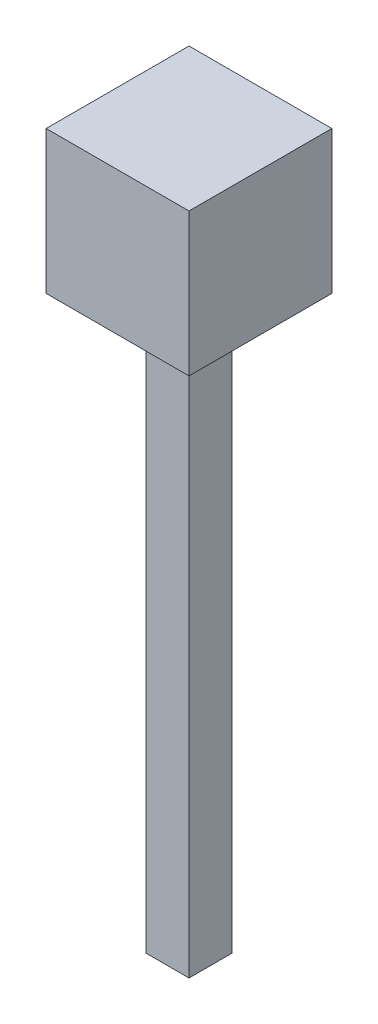
ISO-10303-21;
HEADER;
FILE_DESCRIPTION(('STEP AP214'),'2;1');
FILE_NAME('part.step','',(''),(''),'','','');
FILE_SCHEMA(('AUTOMOTIVE_DESIGN { 1 0 10303 214 1 1 1 1 }'));
ENDSEC;
DATA;
#1=APPLICATION_CONTEXT('core data for automotive mechanical design processes');
#2=APPLICATION_PROTOCOL_DEFINITION('international standard','automotive_design',2000,#1);
#3=PRODUCT_CONTEXT('',#1,'mechanical');
#4=PRODUCT('Part','Part','',(#3));
#5=PRODUCT_RELATED_PRODUCT_CATEGORY('part','',(#4));
#6=PRODUCT_DEFINITION_FORMATION('','',#4);
#7=PRODUCT_DEFINITION_CONTEXT('part definition',#1,'design');
#8=PRODUCT_DEFINITION('design','',#6,#7);
#9=PRODUCT_DEFINITION_SHAPE('','',#8);
#10=(LENGTH_UNIT() NAMED_UNIT(*) SI_UNIT(.MILLI.,.METRE.));
#11=(NAMED_UNIT(*) PLANE_ANGLE_UNIT() SI_UNIT($,.RADIAN.));
#12=(NAMED_UNIT(*) SI_UNIT($,.STERADIAN.) SOLID_ANGLE_UNIT());
#13=UNCERTAINTY_MEASURE_WITH_UNIT(LENGTH_MEASURE(1.E-05),#10,'distance_accuracy_value','');
#14=(GEOMETRIC_REPRESENTATION_CONTEXT(3) GLOBAL_UNCERTAINTY_ASSIGNED_CONTEXT((#13)) GLOBAL_UNIT_ASSIGNED_CONTEXT((#10,
#11,#12)) REPRESENTATION_CONTEXT('',''));
#15=CARTESIAN_POINT('',(0.,0.,0.));
#16=DIRECTION('',(0.,0.,1.));
#17=DIRECTION('',(1.,0.,0.));
#18=AXIS2_PLACEMENT_3D('',#15,#16,#17);
#19=CARTESIAN_POINT('',(3.,100.,0.));
#20=DIRECTION('',(1.,0.,0.));
#21=DIRECTION('',(0.,0.,-1.));
#22=AXIS2_PLACEMENT_3D('',#19,#20,#21);
#23=PLANE('',#22);
#24=DIRECTION('',(0.,-1.,0.));
#25=VECTOR('',#24,1.);
#26=CARTESIAN_POINT('',(3.,100.,-3.));
#27=LINE('',#26,#25);
#28=CARTESIAN_POINT('',(3.,80.,-3.));
#29=VERTEX_POINT('',#28);
#30=CARTESIAN_POINT('',(3.,0.,-3.));
#31=VERTEX_POINT('',#30);
#32=EDGE_CURVE('E55',#29,#31,#27,.T.);
#33=ORIENTED_EDGE('',*,*,#32,.F.);
#34=DIRECTION('',(0.,0.,1.));
#35=VECTOR('',#34,1.);
#36=CARTESIAN_POINT('',(3.,80.,0.));
#37=LINE('',#36,#35);
#38=CARTESIAN_POINT('',(3.,80.,3.));
#39=VERTEX_POINT('',#38);
#40=EDGE_CURVE('E171',#29,#39,#37,.T.);
#41=ORIENTED_EDGE('',*,*,#40,.T.);
#42=DIRECTION('',(0.,-1.,0.));
#43=VECTOR('',#42,1.);
#44=CARTESIAN_POINT('',(3.,100.,3.));
#45=LINE('',#44,#43);
#46=CARTESIAN_POINT('',(3.,0.,3.));
#47=VERTEX_POINT('',#46);
#48=EDGE_CURVE('E191',#39,#47,#45,.T.);
#49=ORIENTED_EDGE('',*,*,#48,.T.);
#50=DIRECTION('',(0.,0.,1.));
#51=VECTOR('',#50,1.);
#52=CARTESIAN_POINT('',(3.,0.,0.));
#53=LINE('',#52,#51);
#54=EDGE_CURVE('E175',#31,#47,#53,.T.);
#55=ORIENTED_EDGE('',*,*,#54,.F.);
#56=EDGE_LOOP('',(#33,#41,#49,#55));
#57=FACE_BOUND('',#56,.T.);
#58=ADVANCED_FACE('F47',(#57),#23,.T.);
#59=CARTESIAN_POINT('',(0.,100.,-3.));
#60=DIRECTION('',(0.,0.,-1.));
#61=DIRECTION('',(-1.,0.,0.));
#62=AXIS2_PLACEMENT_3D('',#59,#60,#61);
#63=PLANE('',#62);
#64=DIRECTION('',(0.,-1.,0.));
#65=VECTOR('',#64,1.);
#66=CARTESIAN_POINT('',(-3.,100.,-3.));
#67=LINE('',#66,#65);
#68=CARTESIAN_POINT('',(-3.,80.,-3.));
#69=VERTEX_POINT('',#68);
#70=CARTESIAN_POINT('',(-3.,0.,-3.));
#71=VERTEX_POINT('',#70);
#72=EDGE_CURVE('E197',#69,#71,#67,.T.);
#73=ORIENTED_EDGE('',*,*,#72,.F.);
#74=DIRECTION('',(1.,0.,0.));
#75=VECTOR('',#74,1.);
#76=CARTESIAN_POINT('',(0.,80.,-3.));
#77=LINE('',#76,#75);
#78=EDGE_CURVE('E62',#69,#29,#77,.T.);
#79=ORIENTED_EDGE('',*,*,#78,.T.);
#80=ORIENTED_EDGE('',*,*,#32,.T.);
#81=DIRECTION('',(1.,0.,0.));
#82=VECTOR('',#81,1.);
#83=CARTESIAN_POINT('',(0.,0.,-3.));
#84=LINE('',#83,#82);
#85=EDGE_CURVE('E179',#71,#31,#84,.T.);
#86=ORIENTED_EDGE('',*,*,#85,.F.);
#87=EDGE_LOOP('',(#73,#79,#80,#86));
#88=FACE_BOUND('',#87,.T.);
#89=ADVANCED_FACE('F202',(#88),#63,.T.);
#90=CARTESIAN_POINT('',(-3.,100.,0.));
#91=DIRECTION('',(1.,0.,0.));
#92=DIRECTION('',(0.,0.,-1.));
#93=AXIS2_PLACEMENT_3D('',#90,#91,#92);
#94=PLANE('',#93);
#95=DIRECTION('',(0.,0.,1.));
#96=VECTOR('',#95,1.);
#97=CARTESIAN_POINT('',(-3.,80.,0.));
#98=LINE('',#97,#96);
#99=CARTESIAN_POINT('',(-3.,80.,3.));
#100=VERTEX_POINT('',#99);
#101=EDGE_CURVE('E70',#69,#100,#98,.T.);
#102=ORIENTED_EDGE('',*,*,#101,.F.);
#103=ORIENTED_EDGE('',*,*,#72,.T.);
#104=DIRECTION('',(0.,0.,1.));
#105=VECTOR('',#104,1.);
#106=CARTESIAN_POINT('',(-3.,0.,0.));
#107=LINE('',#106,#105);
#108=CARTESIAN_POINT('',(-3.,0.,3.));
#109=VERTEX_POINT('',#108);
#110=EDGE_CURVE('E183',#71,#109,#107,.T.);
#111=ORIENTED_EDGE('',*,*,#110,.T.);
#112=DIRECTION('',(0.,-1.,0.));
#113=VECTOR('',#112,1.);
#114=CARTESIAN_POINT('',(-3.,100.,3.));
#115=LINE('',#114,#113);
#116=EDGE_CURVE('E194',#100,#109,#115,.T.);
#117=ORIENTED_EDGE('',*,*,#116,.F.);
#118=EDGE_LOOP('',(#102,#103,#111,#117));
#119=FACE_BOUND('',#118,.T.);
#120=ADVANCED_FACE('F209',(#119),#94,.F.);
#121=CARTESIAN_POINT('',(0.,100.,3.));
#122=DIRECTION('',(0.,0.,-1.));
#123=DIRECTION('',(-1.,0.,0.));
#124=AXIS2_PLACEMENT_3D('',#121,#122,#123);
#125=PLANE('',#124);
#126=DIRECTION('',(1.,0.,0.));
#127=VECTOR('',#126,1.);
#128=CARTESIAN_POINT('',(0.,80.,3.));
#129=LINE('',#128,#127);
#130=EDGE_CURVE('E11',#100,#39,#129,.T.);
#131=ORIENTED_EDGE('',*,*,#130,.F.);
#132=ORIENTED_EDGE('',*,*,#116,.T.);
#133=DIRECTION('',(1.,0.,0.));
#134=VECTOR('',#133,1.);
#135=CARTESIAN_POINT('',(0.,0.,3.));
#136=LINE('',#135,#134);
#137=EDGE_CURVE('E187',#109,#47,#136,.T.);
#138=ORIENTED_EDGE('',*,*,#137,.T.);
#139=ORIENTED_EDGE('',*,*,#48,.F.);
#140=EDGE_LOOP('',(#131,#132,#138,#139));
#141=FACE_BOUND('',#140,.T.);
#142=ADVANCED_FACE('F212',(#141),#125,.F.);
#143=CARTESIAN_POINT('',(0.,0.,0.));
#144=DIRECTION('',(0.,1.,0.));
#145=DIRECTION('',(0.,0.,1.));
#146=AXIS2_PLACEMENT_3D('',#143,#144,#145);
#147=PLANE('',#146);
#148=ORIENTED_EDGE('',*,*,#54,.T.);
#149=ORIENTED_EDGE('',*,*,#137,.F.);
#150=ORIENTED_EDGE('',*,*,#110,.F.);
#151=ORIENTED_EDGE('',*,*,#85,.T.);
#152=EDGE_LOOP('',(#148,#149,#150,#151));
#153=FACE_BOUND('',#152,.T.);
#154=ADVANCED_FACE('F208',(#153),#147,.F.);
#155=CARTESIAN_POINT('',(10.,80.,-10.));
#156=DIRECTION('',(1.,0.,0.));
#157=DIRECTION('',(0.,0.,-1.));
#158=AXIS2_PLACEMENT_3D('',#155,#156,#157);
#159=PLANE('',#158);
#160=DIRECTION('',(0.,0.,-1.));
#161=VECTOR('',#160,1.);
#162=CARTESIAN_POINT('',(10.,100.,-10.));
#163=LINE('',#162,#161);
#164=CARTESIAN_POINT('',(10.,100.,10.));
#165=VERTEX_POINT('',#164);
#166=CARTESIAN_POINT('',(10.,100.,-10.));
#167=VERTEX_POINT('',#166);
#168=EDGE_CURVE('E152',#165,#167,#163,.T.);
#169=ORIENTED_EDGE('',*,*,#168,.F.);
#170=DIRECTION('',(0.,1.,0.));
#171=VECTOR('',#170,1.);
#172=CARTESIAN_POINT('',(10.,80.,10.));
#173=LINE('',#172,#171);
#174=CARTESIAN_POINT('',(10.,80.,10.));
#175=VERTEX_POINT('',#174);
#176=EDGE_CURVE('E139',#175,#165,#173,.T.);
#177=ORIENTED_EDGE('',*,*,#176,.F.);
#178=DIRECTION('',(0.,0.,-1.));
#179=VECTOR('',#178,1.);
#180=CARTESIAN_POINT('',(10.,80.,-10.));
#181=LINE('',#180,#179);
#182=CARTESIAN_POINT('',(10.,80.,-10.));
#183=VERTEX_POINT('',#182);
#184=EDGE_CURVE('E132',#175,#183,#181,.T.);
#185=ORIENTED_EDGE('',*,*,#184,.T.);
#186=DIRECTION('',(0.,1.,0.));
#187=VECTOR('',#186,1.);
#188=CARTESIAN_POINT('',(10.,80.,-10.));
#189=LINE('',#188,#187);
#190=EDGE_CURVE('E113',#183,#167,#189,.T.);
#191=ORIENTED_EDGE('',*,*,#190,.T.);
#192=EDGE_LOOP('',(#169,#177,#185,#191));
#193=FACE_BOUND('',#192,.T.);
#194=ADVANCED_FACE('F138',(#193),#159,.T.);
#195=CARTESIAN_POINT('',(-10.,80.,10.));
#196=DIRECTION('',(0.,0.,1.));
#197=DIRECTION('',(1.,0.,0.));
#198=AXIS2_PLACEMENT_3D('',#195,#196,#197);
#199=PLANE('',#198);
#200=DIRECTION('',(1.,0.,0.));
#201=VECTOR('',#200,1.);
#202=CARTESIAN_POINT('',(-10.,100.,10.));
#203=LINE('',#202,#201);
#204=CARTESIAN_POINT('',(-10.,100.,10.));
#205=VERTEX_POINT('',#204);
#206=EDGE_CURVE('E141',#205,#165,#203,.T.);
#207=ORIENTED_EDGE('',*,*,#206,.F.);
#208=DIRECTION('',(0.,1.,0.));
#209=VECTOR('',#208,1.);
#210=CARTESIAN_POINT('',(-10.,80.,10.));
#211=LINE('',#210,#209);
#212=CARTESIAN_POINT('',(-10.,80.,10.));
#213=VERTEX_POINT('',#212);
#214=EDGE_CURVE('E162',#213,#205,#211,.T.);
#215=ORIENTED_EDGE('',*,*,#214,.F.);
#216=DIRECTION('',(1.,0.,0.));
#217=VECTOR('',#216,1.);
#218=CARTESIAN_POINT('',(-10.,80.,10.));
#219=LINE('',#218,#217);
#220=EDGE_CURVE('E125',#213,#175,#219,.T.);
#221=ORIENTED_EDGE('',*,*,#220,.T.);
#222=ORIENTED_EDGE('',*,*,#176,.T.);
#223=EDGE_LOOP('',(#207,#215,#221,#222));
#224=FACE_BOUND('',#223,.T.);
#225=ADVANCED_FACE('F281',(#224),#199,.T.);
#226=CARTESIAN_POINT('',(-10.,80.,-10.));
#227=DIRECTION('',(-1.,0.,0.));
#228=DIRECTION('',(0.,0.,1.));
#229=AXIS2_PLACEMENT_3D('',#226,#227,#228);
#230=PLANE('',#229);
#231=DIRECTION('',(0.,0.,1.));
#232=VECTOR('',#231,1.);
#233=CARTESIAN_POINT('',(-10.,100.,-10.));
#234=LINE('',#233,#232);
#235=CARTESIAN_POINT('',(-10.,100.,-10.));
#236=VERTEX_POINT('',#235);
#237=EDGE_CURVE('E145',#236,#205,#234,.T.);
#238=ORIENTED_EDGE('',*,*,#237,.F.);
#239=DIRECTION('',(0.,1.,0.));
#240=VECTOR('',#239,1.);
#241=CARTESIAN_POINT('',(-10.,80.,-10.));
#242=LINE('',#241,#240);
#243=CARTESIAN_POINT('',(-10.,80.,-10.));
#244=VERTEX_POINT('',#243);
#245=EDGE_CURVE('E124',#244,#236,#242,.T.);
#246=ORIENTED_EDGE('',*,*,#245,.F.);
#247=DIRECTION('',(0.,0.,1.));
#248=VECTOR('',#247,1.);
#249=CARTESIAN_POINT('',(-10.,80.,-10.));
#250=LINE('',#249,#248);
#251=EDGE_CURVE('E135',#244,#213,#250,.T.);
#252=ORIENTED_EDGE('',*,*,#251,.T.);
#253=ORIENTED_EDGE('',*,*,#214,.T.);
#254=EDGE_LOOP('',(#238,#246,#252,#253));
#255=FACE_BOUND('',#254,.T.);
#256=ADVANCED_FACE('F272',(#255),#230,.T.);
#257=CARTESIAN_POINT('',(-10.,80.,-10.));
#258=DIRECTION('',(0.,0.,-1.));
#259=DIRECTION('',(-1.,0.,0.));
#260=AXIS2_PLACEMENT_3D('',#257,#258,#259);
#261=PLANE('',#260);
#262=DIRECTION('',(-1.,0.,0.));
#263=VECTOR('',#262,1.);
#264=CARTESIAN_POINT('',(-10.,100.,-10.));
#265=LINE('',#264,#263);
#266=EDGE_CURVE('E118',#167,#236,#265,.T.);
#267=ORIENTED_EDGE('',*,*,#266,.F.);
#268=ORIENTED_EDGE('',*,*,#190,.F.);
#269=DIRECTION('',(-1.,0.,0.));
#270=VECTOR('',#269,1.);
#271=CARTESIAN_POINT('',(-10.,80.,-10.));
#272=LINE('',#271,#270);
#273=EDGE_CURVE('E116',#183,#244,#272,.T.);
#274=ORIENTED_EDGE('',*,*,#273,.T.);
#275=ORIENTED_EDGE('',*,*,#245,.T.);
#276=EDGE_LOOP('',(#267,#268,#274,#275));
#277=FACE_BOUND('',#276,.T.);
#278=ADVANCED_FACE('F115',(#277),#261,.T.);
#279=CARTESIAN_POINT('',(0.,80.,0.));
#280=DIRECTION('',(0.,1.,0.));
#281=DIRECTION('',(0.,0.,1.));
#282=AXIS2_PLACEMENT_3D('',#279,#280,#281);
#283=PLANE('',#282);
#284=ORIENTED_EDGE('',*,*,#40,.F.);
#285=ORIENTED_EDGE('',*,*,#78,.F.);
#286=ORIENTED_EDGE('',*,*,#101,.T.);
#287=ORIENTED_EDGE('',*,*,#130,.T.);
#288=EDGE_LOOP('',(#284,#285,#286,#287));
#289=FACE_BOUND('',#288,.T.);
#290=ORIENTED_EDGE('',*,*,#184,.F.);
#291=ORIENTED_EDGE('',*,*,#220,.F.);
#292=ORIENTED_EDGE('',*,*,#251,.F.);
#293=ORIENTED_EDGE('',*,*,#273,.F.);
#294=EDGE_LOOP('',(#290,#291,#292,#293));
#295=FACE_BOUND('',#294,.T.);
#296=ADVANCED_FACE('F130',(#289,#295),#283,.F.);
#297=CARTESIAN_POINT('',(0.,100.,0.));
#298=DIRECTION('',(0.,1.,0.));
#299=DIRECTION('',(0.,0.,1.));
#300=AXIS2_PLACEMENT_3D('',#297,#298,#299);
#301=PLANE('',#300);
#302=ORIENTED_EDGE('',*,*,#168,.T.);
#303=ORIENTED_EDGE('',*,*,#266,.T.);
#304=ORIENTED_EDGE('',*,*,#237,.T.);
#305=ORIENTED_EDGE('',*,*,#206,.T.);
#306=EDGE_LOOP('',(#302,#303,#304,#305));
#307=FACE_BOUND('',#306,.T.);
#308=ADVANCED_FACE('F247',(#307),#301,.T.);
#309=CLOSED_SHELL('',(#58,#89,#120,#142,#154,#194,#225,#256,#278,#296,#308));
#310=MANIFOLD_SOLID_BREP('B2',#309);
#311=ADVANCED_BREP_SHAPE_REPRESENTATION('',(#18,#310),#14);
#312=SHAPE_DEFINITION_REPRESENTATION(#9,#311);
ENDSEC;
END-ISO-10303-21;
